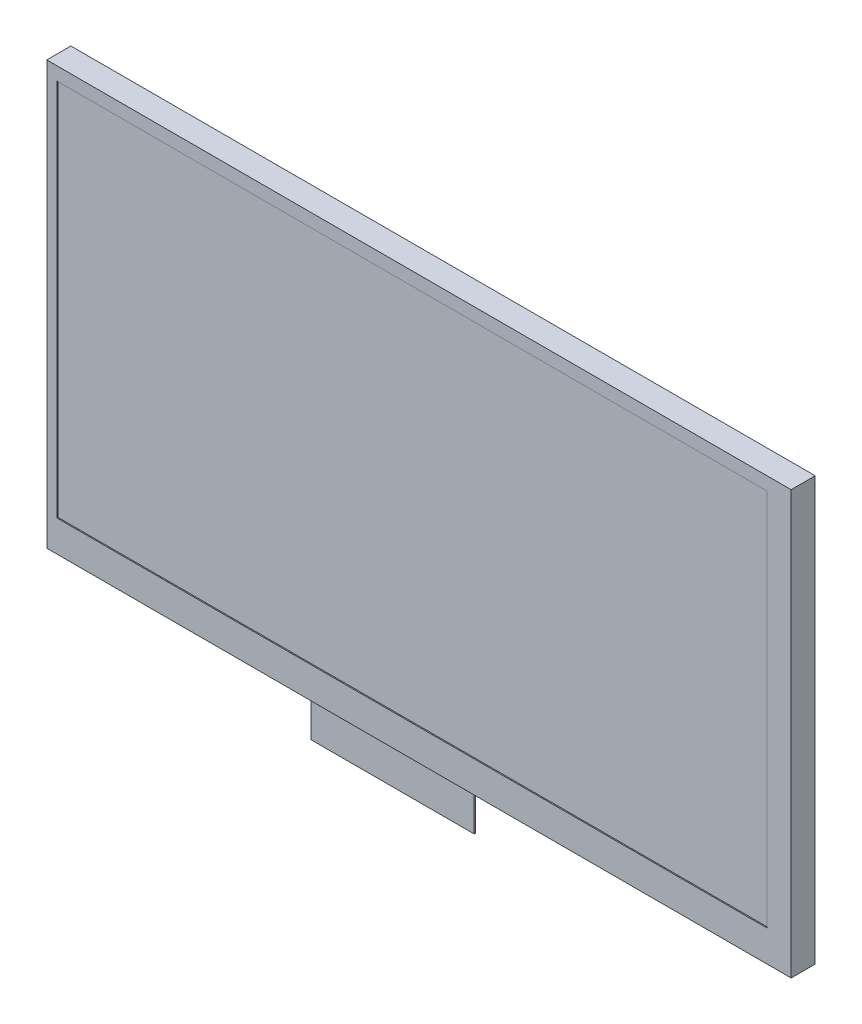
ISO-10303-21;
HEADER;
FILE_DESCRIPTION(('STEP AP214'),'2;1');
FILE_NAME('part.step','',(''),(''),'','','');
FILE_SCHEMA(('AUTOMOTIVE_DESIGN { 1 0 10303 214 1 1 1 1 }'));
ENDSEC;
DATA;
#1=APPLICATION_CONTEXT('core data for automotive mechanical design processes');
#2=APPLICATION_PROTOCOL_DEFINITION('international standard','automotive_design',2000,#1);
#3=PRODUCT_CONTEXT('',#1,'mechanical');
#4=PRODUCT('Part','Part','',(#3));
#5=PRODUCT_RELATED_PRODUCT_CATEGORY('part','',(#4));
#6=PRODUCT_DEFINITION_FORMATION('','',#4);
#7=PRODUCT_DEFINITION_CONTEXT('part definition',#1,'design');
#8=PRODUCT_DEFINITION('design','',#6,#7);
#9=PRODUCT_DEFINITION_SHAPE('','',#8);
#10=(LENGTH_UNIT() NAMED_UNIT(*) SI_UNIT(.MILLI.,.METRE.));
#11=(NAMED_UNIT(*) PLANE_ANGLE_UNIT() SI_UNIT($,.RADIAN.));
#12=(NAMED_UNIT(*) SI_UNIT($,.STERADIAN.) SOLID_ANGLE_UNIT());
#13=UNCERTAINTY_MEASURE_WITH_UNIT(LENGTH_MEASURE(1.E-05),#10,'distance_accuracy_value','');
#14=(GEOMETRIC_REPRESENTATION_CONTEXT(3) GLOBAL_UNCERTAINTY_ASSIGNED_CONTEXT((#13)) GLOBAL_UNIT_ASSIGNED_CONTEXT((#10,
#11,#12)) REPRESENTATION_CONTEXT('',''));
#15=CARTESIAN_POINT('',(0.,0.,0.));
#16=DIRECTION('',(0.,0.,1.));
#17=DIRECTION('',(1.,0.,0.));
#18=AXIS2_PLACEMENT_3D('',#15,#16,#17);
#19=CARTESIAN_POINT('',(0.,-50.,-5.7));
#20=DIRECTION('',(0.,-1.,0.));
#21=DIRECTION('',(0.,0.,-1.));
#22=AXIS2_PLACEMENT_3D('',#19,#20,#21);
#23=PLANE('',#22);
#24=DIRECTION('',(1.,0.,0.));
#25=VECTOR('',#24,1.);
#26=CARTESIAN_POINT('',(0.,-50.,0.));
#27=LINE('',#26,#25);
#28=CARTESIAN_POINT('',(-88.011,-50.,0.));
#29=VERTEX_POINT('',#28);
#30=CARTESIAN_POINT('',(88.011,-50.,0.));
#31=VERTEX_POINT('',#30);
#32=EDGE_CURVE('E187',#29,#31,#27,.T.);
#33=ORIENTED_EDGE('',*,*,#32,.F.);
#34=DIRECTION('',(0.,0.,1.));
#35=VECTOR('',#34,1.);
#36=CARTESIAN_POINT('',(-88.011,-50.,-5.7));
#37=LINE('',#36,#35);
#38=CARTESIAN_POINT('',(-88.011,-50.,-5.7));
#39=VERTEX_POINT('',#38);
#40=EDGE_CURVE('E11',#39,#29,#37,.T.);
#41=ORIENTED_EDGE('',*,*,#40,.F.);
#42=DIRECTION('',(1.,0.,0.));
#43=VECTOR('',#42,1.);
#44=CARTESIAN_POINT('',(0.,-50.,-5.7));
#45=LINE('',#44,#43);
#46=CARTESIAN_POINT('',(88.011,-50.,-5.7));
#47=VERTEX_POINT('',#46);
#48=EDGE_CURVE('E194',#39,#47,#45,.T.);
#49=ORIENTED_EDGE('',*,*,#48,.T.);
#50=DIRECTION('',(0.,0.,1.));
#51=VECTOR('',#50,1.);
#52=CARTESIAN_POINT('',(88.011,-50.,-5.7));
#53=LINE('',#52,#51);
#54=EDGE_CURVE('E40',#47,#31,#53,.T.);
#55=ORIENTED_EDGE('',*,*,#54,.T.);
#56=EDGE_LOOP('',(#33,#41,#49,#55));
#57=FACE_BOUND('',#56,.T.);
#58=DIRECTION('',(0.,0.,1.));
#59=VECTOR('',#58,1.);
#60=CARTESIAN_POINT('',(11.89482,-50.,-1.4732));
#61=LINE('',#60,#59);
#62=CARTESIAN_POINT('',(11.89482,-50.,-1.4732));
#63=VERTEX_POINT('',#62);
#64=CARTESIAN_POINT('',(11.89482,-50.,-1.1684));
#65=VERTEX_POINT('',#64);
#66=EDGE_CURVE('E58',#63,#65,#61,.T.);
#67=ORIENTED_EDGE('',*,*,#66,.F.);
#68=DIRECTION('',(-1.,0.,0.));
#69=VECTOR('',#68,1.);
#70=CARTESIAN_POINT('',(-26.6446,-50.,-1.4732));
#71=LINE('',#70,#69);
#72=CARTESIAN_POINT('',(-26.6446,-50.,-1.4732));
#73=VERTEX_POINT('',#72);
#74=EDGE_CURVE('E53',#63,#73,#71,.T.);
#75=ORIENTED_EDGE('',*,*,#74,.T.);
#76=DIRECTION('',(0.,0.,1.));
#77=VECTOR('',#76,1.);
#78=CARTESIAN_POINT('',(-26.6446,-50.,-1.4732));
#79=LINE('',#78,#77);
#80=CARTESIAN_POINT('',(-26.6446,-50.,-1.1684));
#81=VERTEX_POINT('',#80);
#82=EDGE_CURVE('E145',#73,#81,#79,.T.);
#83=ORIENTED_EDGE('',*,*,#82,.T.);
#84=DIRECTION('',(-1.,0.,0.));
#85=VECTOR('',#84,1.);
#86=CARTESIAN_POINT('',(-26.6446,-50.,-1.1684));
#87=LINE('',#86,#85);
#88=EDGE_CURVE('E146',#65,#81,#87,.T.);
#89=ORIENTED_EDGE('',*,*,#88,.F.);
#90=EDGE_LOOP('',(#67,#75,#83,#89));
#91=FACE_BOUND('',#90,.T.);
#92=ADVANCED_FACE('F37',(#57,#91),#23,.T.);
#93=CARTESIAN_POINT('',(0.,0.,0.));
#94=DIRECTION('',(0.,0.,1.));
#95=DIRECTION('',(1.,0.,0.));
#96=AXIS2_PLACEMENT_3D('',#93,#94,#95);
#97=PLANE('',#96);
#98=ORIENTED_EDGE('',*,*,#32,.T.);
#99=DIRECTION('',(0.,1.,0.));
#100=VECTOR('',#99,1.);
#101=CARTESIAN_POINT('',(88.011,0.,0.));
#102=LINE('',#101,#100);
#103=CARTESIAN_POINT('',(88.011,50.,0.));
#104=VERTEX_POINT('',#103);
#105=EDGE_CURVE('E207',#31,#104,#102,.T.);
#106=ORIENTED_EDGE('',*,*,#105,.T.);
#107=DIRECTION('',(1.,0.,0.));
#108=VECTOR('',#107,1.);
#109=CARTESIAN_POINT('',(0.,50.,0.));
#110=LINE('',#109,#108);
#111=CARTESIAN_POINT('',(-88.011,50.,0.));
#112=VERTEX_POINT('',#111);
#113=EDGE_CURVE('E210',#112,#104,#110,.T.);
#114=ORIENTED_EDGE('',*,*,#113,.F.);
#115=DIRECTION('',(0.,1.,0.));
#116=VECTOR('',#115,1.);
#117=CARTESIAN_POINT('',(-88.011,0.,0.));
#118=LINE('',#117,#116);
#119=EDGE_CURVE('E198',#29,#112,#118,.T.);
#120=ORIENTED_EDGE('',*,*,#119,.F.);
#121=EDGE_LOOP('',(#98,#106,#114,#120));
#122=FACE_BOUND('',#121,.T.);
#123=DIRECTION('',(1.,0.,0.));
#124=VECTOR('',#123,1.);
#125=CARTESIAN_POINT('',(0.,46.8758,0.));
#126=LINE('',#125,#124);
#127=CARTESIAN_POINT('',(-85.6234,46.8758,0.));
#128=VERTEX_POINT('',#127);
#129=CARTESIAN_POINT('',(82.3468,46.8758,0.));
#130=VERTEX_POINT('',#129);
#131=EDGE_CURVE('E177',#128,#130,#126,.T.);
#132=ORIENTED_EDGE('',*,*,#131,.T.);
#133=DIRECTION('',(0.,-1.,0.));
#134=VECTOR('',#133,1.);
#135=CARTESIAN_POINT('',(82.3468,0.,0.));
#136=LINE('',#135,#134);
#137=CARTESIAN_POINT('',(82.3468,-42.6086,0.));
#138=VERTEX_POINT('',#137);
#139=EDGE_CURVE('E160',#130,#138,#136,.T.);
#140=ORIENTED_EDGE('',*,*,#139,.T.);
#141=DIRECTION('',(1.,0.,0.));
#142=VECTOR('',#141,1.);
#143=CARTESIAN_POINT('',(0.,-42.6086,0.));
#144=LINE('',#143,#142);
#145=CARTESIAN_POINT('',(-85.6234,-42.6086,0.));
#146=VERTEX_POINT('',#145);
#147=EDGE_CURVE('E166',#146,#138,#144,.T.);
#148=ORIENTED_EDGE('',*,*,#147,.F.);
#149=DIRECTION('',(0.,-1.,0.));
#150=VECTOR('',#149,1.);
#151=CARTESIAN_POINT('',(-85.6234,0.,0.));
#152=LINE('',#151,#150);
#153=EDGE_CURVE('E180',#128,#146,#152,.T.);
#154=ORIENTED_EDGE('',*,*,#153,.F.);
#155=EDGE_LOOP('',(#132,#140,#148,#154));
#156=FACE_BOUND('',#155,.T.);
#157=ADVANCED_FACE('F227',(#122,#156),#97,.T.);
#158=CARTESIAN_POINT('',(-88.011,0.,-5.7));
#159=DIRECTION('',(1.,0.,0.));
#160=DIRECTION('',(0.,0.,-1.));
#161=AXIS2_PLACEMENT_3D('',#158,#159,#160);
#162=PLANE('',#161);
#163=ORIENTED_EDGE('',*,*,#119,.T.);
#164=DIRECTION('',(0.,0.,1.));
#165=VECTOR('',#164,1.);
#166=CARTESIAN_POINT('',(-88.011,50.,-5.7));
#167=LINE('',#166,#165);
#168=CARTESIAN_POINT('',(-88.011,50.,-5.7));
#169=VERTEX_POINT('',#168);
#170=EDGE_CURVE('E45',#169,#112,#167,.T.);
#171=ORIENTED_EDGE('',*,*,#170,.F.);
#172=DIRECTION('',(0.,1.,0.));
#173=VECTOR('',#172,1.);
#174=CARTESIAN_POINT('',(-88.011,0.,-5.7));
#175=LINE('',#174,#173);
#176=EDGE_CURVE('E203',#39,#169,#175,.T.);
#177=ORIENTED_EDGE('',*,*,#176,.F.);
#178=ORIENTED_EDGE('',*,*,#40,.T.);
#179=EDGE_LOOP('',(#163,#171,#177,#178));
#180=FACE_BOUND('',#179,.T.);
#181=ADVANCED_FACE('F231',(#180),#162,.F.);
#182=CARTESIAN_POINT('',(0.,50.,-5.7));
#183=DIRECTION('',(0.,-1.,0.));
#184=DIRECTION('',(0.,0.,-1.));
#185=AXIS2_PLACEMENT_3D('',#182,#183,#184);
#186=PLANE('',#185);
#187=ORIENTED_EDGE('',*,*,#113,.T.);
#188=DIRECTION('',(0.,0.,1.));
#189=VECTOR('',#188,1.);
#190=CARTESIAN_POINT('',(88.011,50.,-5.7));
#191=LINE('',#190,#189);
#192=CARTESIAN_POINT('',(88.011,50.,-5.7));
#193=VERTEX_POINT('',#192);
#194=EDGE_CURVE('E215',#193,#104,#191,.T.);
#195=ORIENTED_EDGE('',*,*,#194,.F.);
#196=DIRECTION('',(1.,0.,0.));
#197=VECTOR('',#196,1.);
#198=CARTESIAN_POINT('',(0.,50.,-5.7));
#199=LINE('',#198,#197);
#200=EDGE_CURVE('E201',#169,#193,#199,.T.);
#201=ORIENTED_EDGE('',*,*,#200,.F.);
#202=ORIENTED_EDGE('',*,*,#170,.T.);
#203=EDGE_LOOP('',(#187,#195,#201,#202));
#204=FACE_BOUND('',#203,.T.);
#205=ADVANCED_FACE('F235',(#204),#186,.F.);
#206=CARTESIAN_POINT('',(88.011,0.,-5.7));
#207=DIRECTION('',(1.,0.,0.));
#208=DIRECTION('',(0.,0.,-1.));
#209=AXIS2_PLACEMENT_3D('',#206,#207,#208);
#210=PLANE('',#209);
#211=ORIENTED_EDGE('',*,*,#105,.F.);
#212=ORIENTED_EDGE('',*,*,#54,.F.);
#213=DIRECTION('',(0.,1.,0.));
#214=VECTOR('',#213,1.);
#215=CARTESIAN_POINT('',(88.011,0.,-5.7));
#216=LINE('',#215,#214);
#217=EDGE_CURVE('E197',#47,#193,#216,.T.);
#218=ORIENTED_EDGE('',*,*,#217,.T.);
#219=ORIENTED_EDGE('',*,*,#194,.T.);
#220=EDGE_LOOP('',(#211,#212,#218,#219));
#221=FACE_BOUND('',#220,.T.);
#222=ADVANCED_FACE('F223',(#221),#210,.T.);
#223=CARTESIAN_POINT('',(0.,0.,-5.7));
#224=DIRECTION('',(0.,0.,1.));
#225=DIRECTION('',(1.,0.,0.));
#226=AXIS2_PLACEMENT_3D('',#223,#224,#225);
#227=PLANE('',#226);
#228=ORIENTED_EDGE('',*,*,#48,.F.);
#229=ORIENTED_EDGE('',*,*,#176,.T.);
#230=ORIENTED_EDGE('',*,*,#200,.T.);
#231=ORIENTED_EDGE('',*,*,#217,.F.);
#232=EDGE_LOOP('',(#228,#229,#230,#231));
#233=FACE_BOUND('',#232,.T.);
#234=ADVANCED_FACE('F237',(#233),#227,.F.);
#235=CARTESIAN_POINT('',(82.3468,0.,-0.254));
#236=DIRECTION('',(-1.,0.,0.));
#237=DIRECTION('',(0.,0.,1.));
#238=AXIS2_PLACEMENT_3D('',#235,#236,#237);
#239=PLANE('',#238);
#240=ORIENTED_EDGE('',*,*,#139,.F.);
#241=DIRECTION('',(0.,0.,1.));
#242=VECTOR('',#241,1.);
#243=CARTESIAN_POINT('',(82.3468,46.8758,-0.254));
#244=LINE('',#243,#242);
#245=CARTESIAN_POINT('',(82.3468,46.8758,-0.254));
#246=VERTEX_POINT('',#245);
#247=EDGE_CURVE('E174',#246,#130,#244,.T.);
#248=ORIENTED_EDGE('',*,*,#247,.F.);
#249=DIRECTION('',(0.,-1.,0.));
#250=VECTOR('',#249,1.);
#251=CARTESIAN_POINT('',(82.3468,0.,-0.254));
#252=LINE('',#251,#250);
#253=CARTESIAN_POINT('',(82.3468,-42.6086,-0.254));
#254=VERTEX_POINT('',#253);
#255=EDGE_CURVE('E163',#246,#254,#252,.T.);
#256=ORIENTED_EDGE('',*,*,#255,.T.);
#257=DIRECTION('',(0.,0.,1.));
#258=VECTOR('',#257,1.);
#259=CARTESIAN_POINT('',(82.3468,-42.6086,-0.254));
#260=LINE('',#259,#258);
#261=EDGE_CURVE('E185',#254,#138,#260,.T.);
#262=ORIENTED_EDGE('',*,*,#261,.T.);
#263=EDGE_LOOP('',(#240,#248,#256,#262));
#264=FACE_BOUND('',#263,.T.);
#265=ADVANCED_FACE('F239',(#264),#239,.T.);
#266=CARTESIAN_POINT('',(0.,-42.6086,-0.254));
#267=DIRECTION('',(0.,-1.,0.));
#268=DIRECTION('',(0.,0.,-1.));
#269=AXIS2_PLACEMENT_3D('',#266,#267,#268);
#270=PLANE('',#269);
#271=ORIENTED_EDGE('',*,*,#147,.T.);
#272=ORIENTED_EDGE('',*,*,#261,.F.);
#273=DIRECTION('',(1.,0.,0.));
#274=VECTOR('',#273,1.);
#275=CARTESIAN_POINT('',(0.,-42.6086,-0.254));
#276=LINE('',#275,#274);
#277=CARTESIAN_POINT('',(-85.6234,-42.6086,-0.254));
#278=VERTEX_POINT('',#277);
#279=EDGE_CURVE('E171',#278,#254,#276,.T.);
#280=ORIENTED_EDGE('',*,*,#279,.F.);
#281=DIRECTION('',(0.,0.,1.));
#282=VECTOR('',#281,1.);
#283=CARTESIAN_POINT('',(-85.6234,-42.6086,-0.254));
#284=LINE('',#283,#282);
#285=EDGE_CURVE('E188',#278,#146,#284,.T.);
#286=ORIENTED_EDGE('',*,*,#285,.T.);
#287=EDGE_LOOP('',(#271,#272,#280,#286));
#288=FACE_BOUND('',#287,.T.);
#289=ADVANCED_FACE('F245',(#288),#270,.F.);
#290=CARTESIAN_POINT('',(-85.6234,0.,-0.254));
#291=DIRECTION('',(-1.,0.,0.));
#292=DIRECTION('',(0.,-1.,0.));
#293=AXIS2_PLACEMENT_3D('',#290,#291,#292);
#294=PLANE('',#293);
#295=ORIENTED_EDGE('',*,*,#153,.T.);
#296=ORIENTED_EDGE('',*,*,#285,.F.);
#297=DIRECTION('',(0.,-1.,0.));
#298=VECTOR('',#297,1.);
#299=CARTESIAN_POINT('',(-85.6234,0.,-0.254));
#300=LINE('',#299,#298);
#301=CARTESIAN_POINT('',(-85.6234,46.8758,-0.254));
#302=VERTEX_POINT('',#301);
#303=EDGE_CURVE('E168',#302,#278,#300,.T.);
#304=ORIENTED_EDGE('',*,*,#303,.F.);
#305=DIRECTION('',(0.,0.,1.));
#306=VECTOR('',#305,1.);
#307=CARTESIAN_POINT('',(-85.6234,46.8758,-0.254));
#308=LINE('',#307,#306);
#309=EDGE_CURVE('E190',#302,#128,#308,.T.);
#310=ORIENTED_EDGE('',*,*,#309,.T.);
#311=EDGE_LOOP('',(#295,#296,#304,#310));
#312=FACE_BOUND('',#311,.T.);
#313=ADVANCED_FACE('F290',(#312),#294,.F.);
#314=CARTESIAN_POINT('',(0.,46.8758,-0.254));
#315=DIRECTION('',(0.,-1.,0.));
#316=DIRECTION('',(0.,0.,-1.));
#317=AXIS2_PLACEMENT_3D('',#314,#315,#316);
#318=PLANE('',#317);
#319=ORIENTED_EDGE('',*,*,#131,.F.);
#320=ORIENTED_EDGE('',*,*,#309,.F.);
#321=DIRECTION('',(1.,0.,0.));
#322=VECTOR('',#321,1.);
#323=CARTESIAN_POINT('',(0.,46.8758,-0.254));
#324=LINE('',#323,#322);
#325=EDGE_CURVE('E165',#302,#246,#324,.T.);
#326=ORIENTED_EDGE('',*,*,#325,.T.);
#327=ORIENTED_EDGE('',*,*,#247,.T.);
#328=EDGE_LOOP('',(#319,#320,#326,#327));
#329=FACE_BOUND('',#328,.T.);
#330=ADVANCED_FACE('F300',(#329),#318,.T.);
#331=CARTESIAN_POINT('',(0.,0.,-0.254));
#332=DIRECTION('',(0.,0.,1.));
#333=DIRECTION('',(1.,0.,0.));
#334=AXIS2_PLACEMENT_3D('',#331,#332,#333);
#335=PLANE('',#334);
#336=ORIENTED_EDGE('',*,*,#255,.F.);
#337=ORIENTED_EDGE('',*,*,#325,.F.);
#338=ORIENTED_EDGE('',*,*,#303,.T.);
#339=ORIENTED_EDGE('',*,*,#279,.T.);
#340=EDGE_LOOP('',(#336,#337,#338,#339));
#341=FACE_BOUND('',#340,.T.);
#342=ADVANCED_FACE('F310',(#341),#335,.T.);
#343=CARTESIAN_POINT('',(-26.6446,-50.,-1.4732));
#344=DIRECTION('',(-1.,0.,0.));
#345=DIRECTION('',(0.,-1.,0.));
#346=AXIS2_PLACEMENT_3D('',#343,#344,#345);
#347=PLANE('',#346);
#348=DIRECTION('',(0.,-1.,0.));
#349=VECTOR('',#348,1.);
#350=CARTESIAN_POINT('',(-26.6446,-50.,-1.1684));
#351=LINE('',#350,#349);
#352=CARTESIAN_POINT('',(-26.6446,-59.144,-1.1684));
#353=VERTEX_POINT('',#352);
#354=EDGE_CURVE('E154',#81,#353,#351,.T.);
#355=ORIENTED_EDGE('',*,*,#354,.F.);
#356=ORIENTED_EDGE('',*,*,#82,.F.);
#357=DIRECTION('',(0.,-1.,0.));
#358=VECTOR('',#357,1.);
#359=CARTESIAN_POINT('',(-26.6446,-50.,-1.4732));
#360=LINE('',#359,#358);
#361=CARTESIAN_POINT('',(-26.6446,-59.144,-1.4732));
#362=VERTEX_POINT('',#361);
#363=EDGE_CURVE('E141',#73,#362,#360,.T.);
#364=ORIENTED_EDGE('',*,*,#363,.T.);
#365=DIRECTION('',(0.,0.,1.));
#366=VECTOR('',#365,1.);
#367=CARTESIAN_POINT('',(-26.6446,-59.144,-1.4732));
#368=LINE('',#367,#366);
#369=EDGE_CURVE('E125',#362,#353,#368,.T.);
#370=ORIENTED_EDGE('',*,*,#369,.T.);
#371=EDGE_LOOP('',(#355,#356,#364,#370));
#372=FACE_BOUND('',#371,.T.);
#373=ADVANCED_FACE('F144',(#372),#347,.T.);
#374=CARTESIAN_POINT('',(11.89482,-50.,-1.4732));
#375=DIRECTION('',(1.,0.,0.));
#376=DIRECTION('',(0.,1.,0.));
#377=AXIS2_PLACEMENT_3D('',#374,#375,#376);
#378=PLANE('',#377);
#379=DIRECTION('',(0.,1.,0.));
#380=VECTOR('',#379,1.);
#381=CARTESIAN_POINT('',(11.89482,-50.,-1.1684));
#382=LINE('',#381,#380);
#383=CARTESIAN_POINT('',(11.89482,-59.144,-1.1684));
#384=VERTEX_POINT('',#383);
#385=EDGE_CURVE('E149',#384,#65,#382,.T.);
#386=ORIENTED_EDGE('',*,*,#385,.F.);
#387=DIRECTION('',(0.,0.,1.));
#388=VECTOR('',#387,1.);
#389=CARTESIAN_POINT('',(11.89482,-59.144,-1.4732));
#390=LINE('',#389,#388);
#391=CARTESIAN_POINT('',(11.89482,-59.144,-1.4732));
#392=VERTEX_POINT('',#391);
#393=EDGE_CURVE('E135',#392,#384,#390,.T.);
#394=ORIENTED_EDGE('',*,*,#393,.F.);
#395=DIRECTION('',(0.,1.,0.));
#396=VECTOR('',#395,1.);
#397=CARTESIAN_POINT('',(11.89482,-50.,-1.4732));
#398=LINE('',#397,#396);
#399=EDGE_CURVE('E142',#392,#63,#398,.T.);
#400=ORIENTED_EDGE('',*,*,#399,.T.);
#401=ORIENTED_EDGE('',*,*,#66,.T.);
#402=EDGE_LOOP('',(#386,#394,#400,#401));
#403=FACE_BOUND('',#402,.T.);
#404=ADVANCED_FACE('F334',(#403),#378,.T.);
#405=CARTESIAN_POINT('',(-26.6446,-59.144,-1.4732));
#406=DIRECTION('',(0.,-1.,0.));
#407=DIRECTION('',(0.,0.,-1.));
#408=AXIS2_PLACEMENT_3D('',#405,#406,#407);
#409=PLANE('',#408);
#410=DIRECTION('',(1.,0.,0.));
#411=VECTOR('',#410,1.);
#412=CARTESIAN_POINT('',(-26.6446,-59.144,-1.1684));
#413=LINE('',#412,#411);
#414=EDGE_CURVE('E130',#353,#384,#413,.T.);
#415=ORIENTED_EDGE('',*,*,#414,.F.);
#416=ORIENTED_EDGE('',*,*,#369,.F.);
#417=DIRECTION('',(1.,0.,0.));
#418=VECTOR('',#417,1.);
#419=CARTESIAN_POINT('',(-26.6446,-59.144,-1.4732));
#420=LINE('',#419,#418);
#421=EDGE_CURVE('E128',#362,#392,#420,.T.);
#422=ORIENTED_EDGE('',*,*,#421,.T.);
#423=ORIENTED_EDGE('',*,*,#393,.T.);
#424=EDGE_LOOP('',(#415,#416,#422,#423));
#425=FACE_BOUND('',#424,.T.);
#426=ADVANCED_FACE('F127',(#425),#409,.T.);
#427=CARTESIAN_POINT('',(0.,0.,-1.4732));
#428=DIRECTION('',(0.,0.,1.));
#429=DIRECTION('',(1.,0.,0.));
#430=AXIS2_PLACEMENT_3D('',#427,#428,#429);
#431=PLANE('',#430);
#432=ORIENTED_EDGE('',*,*,#363,.F.);
#433=ORIENTED_EDGE('',*,*,#74,.F.);
#434=ORIENTED_EDGE('',*,*,#399,.F.);
#435=ORIENTED_EDGE('',*,*,#421,.F.);
#436=EDGE_LOOP('',(#432,#433,#434,#435));
#437=FACE_BOUND('',#436,.T.);
#438=ADVANCED_FACE('F140',(#437),#431,.F.);
#439=CARTESIAN_POINT('',(0.,0.,-1.1684));
#440=DIRECTION('',(0.,0.,1.));
#441=DIRECTION('',(1.,0.,0.));
#442=AXIS2_PLACEMENT_3D('',#439,#440,#441);
#443=PLANE('',#442);
#444=ORIENTED_EDGE('',*,*,#354,.T.);
#445=ORIENTED_EDGE('',*,*,#414,.T.);
#446=ORIENTED_EDGE('',*,*,#385,.T.);
#447=ORIENTED_EDGE('',*,*,#88,.T.);
#448=EDGE_LOOP('',(#444,#445,#446,#447));
#449=FACE_BOUND('',#448,.T.);
#450=ADVANCED_FACE('F360',(#449),#443,.T.);
#451=CLOSED_SHELL('',(#92,#157,#181,#205,#222,#234,#265,#289,#313,#330,#342,#373,#404,#426,#438,#450));
#452=MANIFOLD_SOLID_BREP('B2',#451);
#453=ADVANCED_BREP_SHAPE_REPRESENTATION('',(#18,#452),#14);
#454=SHAPE_DEFINITION_REPRESENTATION(#9,#453);
ENDSEC;
END-ISO-10303-21;
